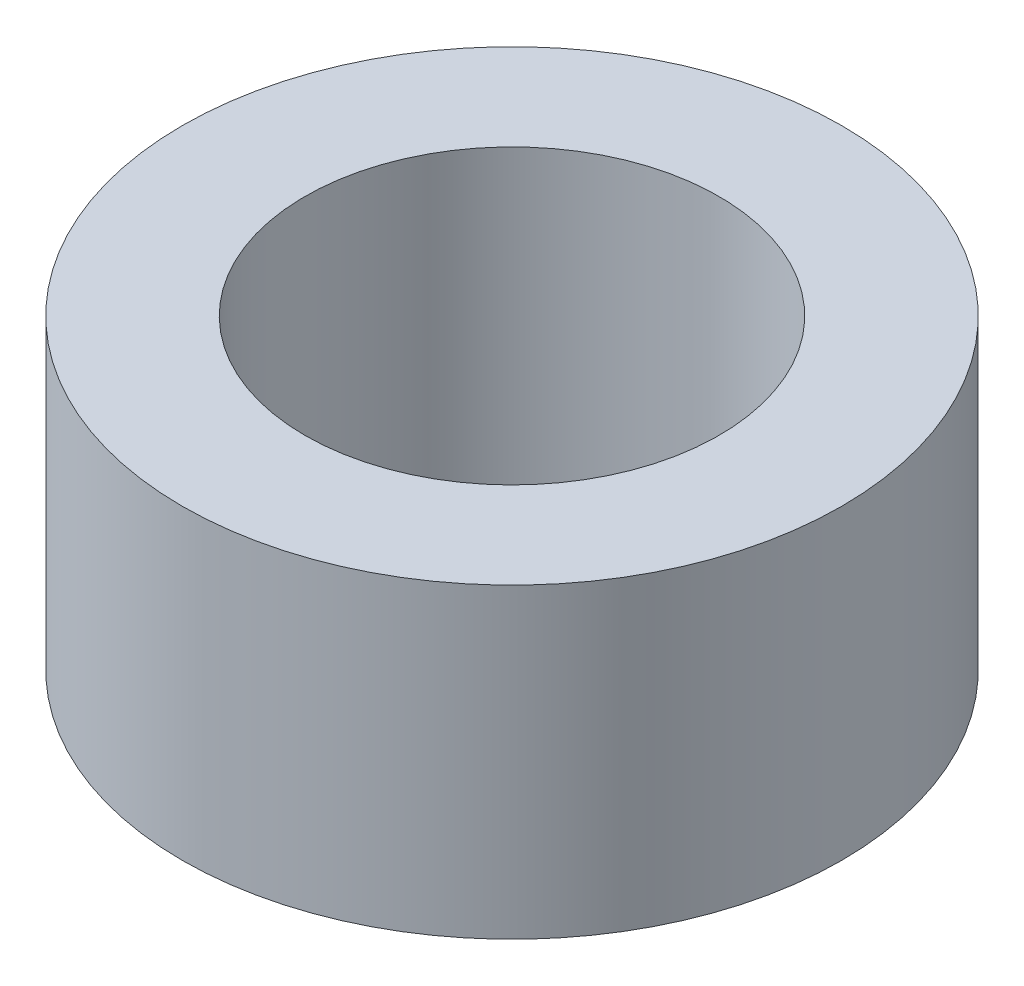
ISO-10303-21;
HEADER;
FILE_DESCRIPTION(('STEP AP214'),'2;1');
FILE_NAME('part.step','',(''),(''),'','','');
FILE_SCHEMA(('AUTOMOTIVE_DESIGN { 1 0 10303 214 1 1 1 1 }'));
ENDSEC;
DATA;
#1=APPLICATION_CONTEXT('core data for automotive mechanical design processes');
#2=APPLICATION_PROTOCOL_DEFINITION('international standard','automotive_design',2000,#1);
#3=PRODUCT_CONTEXT('',#1,'mechanical');
#4=PRODUCT('Part','Part','',(#3));
#5=PRODUCT_RELATED_PRODUCT_CATEGORY('part','',(#4));
#6=PRODUCT_DEFINITION_FORMATION('','',#4);
#7=PRODUCT_DEFINITION_CONTEXT('part definition',#1,'design');
#8=PRODUCT_DEFINITION('design','',#6,#7);
#9=PRODUCT_DEFINITION_SHAPE('','',#8);
#10=(LENGTH_UNIT() NAMED_UNIT(*) SI_UNIT(.MILLI.,.METRE.));
#11=(NAMED_UNIT(*) PLANE_ANGLE_UNIT() SI_UNIT($,.RADIAN.));
#12=(NAMED_UNIT(*) SI_UNIT($,.STERADIAN.) SOLID_ANGLE_UNIT());
#13=UNCERTAINTY_MEASURE_WITH_UNIT(LENGTH_MEASURE(1.E-05),#10,'distance_accuracy_value','');
#14=(GEOMETRIC_REPRESENTATION_CONTEXT(3) GLOBAL_UNCERTAINTY_ASSIGNED_CONTEXT((#13)) GLOBAL_UNIT_ASSIGNED_CONTEXT((#10,
#11,#12)) REPRESENTATION_CONTEXT('',''));
#15=CARTESIAN_POINT('',(0.,0.,0.));
#16=DIRECTION('',(0.,0.,1.));
#17=DIRECTION('',(1.,0.,0.));
#18=AXIS2_PLACEMENT_3D('',#15,#16,#17);
#19=CARTESIAN_POINT('',(0.,5.,0.));
#20=DIRECTION('',(0.,1.,0.));
#21=DIRECTION('',(0.,0.,1.));
#22=AXIS2_PLACEMENT_3D('',#19,#20,#21);
#23=PLANE('',#22);
#24=CARTESIAN_POINT('',(0.,5.,0.));
#25=DIRECTION('',(0.,1.,0.));
#26=DIRECTION('',(0.,0.,1.));
#27=AXIS2_PLACEMENT_3D('',#24,#25,#26);
#28=CIRCLE('',#27,5.375);
#29=CARTESIAN_POINT('',(0.,5.,5.375));
#30=VERTEX_POINT('',#29);
#31=EDGE_CURVE('E10',#30,#30,#28,.T.);
#32=ORIENTED_EDGE('',*,*,#31,.T.);
#33=EDGE_LOOP('',(#32));
#34=FACE_BOUND('',#33,.T.);
#35=CARTESIAN_POINT('',(0.,5.,0.));
#36=DIRECTION('',(0.,1.,0.));
#37=DIRECTION('',(0.,0.,1.));
#38=AXIS2_PLACEMENT_3D('',#35,#36,#37);
#39=CIRCLE('',#38,3.375);
#40=CARTESIAN_POINT('',(0.,5.,3.375));
#41=VERTEX_POINT('',#40);
#42=EDGE_CURVE('E42',#41,#41,#39,.T.);
#43=ORIENTED_EDGE('',*,*,#42,.F.);
#44=EDGE_LOOP('',(#43));
#45=FACE_BOUND('',#44,.T.);
#46=ADVANCED_FACE('F31',(#34,#45),#23,.T.);
#47=CARTESIAN_POINT('',(0.,0.,0.));
#48=DIRECTION('',(0.,1.,0.));
#49=DIRECTION('',(0.,0.,1.));
#50=AXIS2_PLACEMENT_3D('',#47,#48,#49);
#51=PLANE('',#50);
#52=CARTESIAN_POINT('',(0.,0.,0.));
#53=DIRECTION('',(0.,1.,0.));
#54=DIRECTION('',(0.,0.,1.));
#55=AXIS2_PLACEMENT_3D('',#52,#53,#54);
#56=CIRCLE('',#55,5.375);
#57=CARTESIAN_POINT('',(0.,0.,5.375));
#58=VERTEX_POINT('',#57);
#59=EDGE_CURVE('E35',#58,#58,#56,.T.);
#60=ORIENTED_EDGE('',*,*,#59,.F.);
#61=EDGE_LOOP('',(#60));
#62=FACE_BOUND('',#61,.T.);
#63=CARTESIAN_POINT('',(0.,0.,0.));
#64=DIRECTION('',(0.,1.,0.));
#65=DIRECTION('',(0.,0.,1.));
#66=AXIS2_PLACEMENT_3D('',#63,#64,#65);
#67=CIRCLE('',#66,3.375);
#68=CARTESIAN_POINT('',(0.,0.,3.375));
#69=VERTEX_POINT('',#68);
#70=EDGE_CURVE('E44',#69,#69,#67,.T.);
#71=ORIENTED_EDGE('',*,*,#70,.T.);
#72=EDGE_LOOP('',(#71));
#73=FACE_BOUND('',#72,.T.);
#74=ADVANCED_FACE('F54',(#62,#73),#51,.F.);
#75=CARTESIAN_POINT('',(0.,5.,0.));
#76=DIRECTION('',(0.,-1.,0.));
#77=DIRECTION('',(0.,0.,-1.));
#78=AXIS2_PLACEMENT_3D('',#75,#76,#77);
#79=CYLINDRICAL_SURFACE('',#78,5.375);
#80=ORIENTED_EDGE('',*,*,#31,.F.);
#81=EDGE_LOOP('',(#80));
#82=FACE_BOUND('',#81,.T.);
#83=ORIENTED_EDGE('',*,*,#59,.T.);
#84=EDGE_LOOP('',(#83));
#85=FACE_BOUND('',#84,.T.);
#86=ADVANCED_FACE('F33',(#82,#85),#79,.T.);
#87=CARTESIAN_POINT('',(0.,5.,0.));
#88=DIRECTION('',(0.,-1.,0.));
#89=DIRECTION('',(0.,0.,-1.));
#90=AXIS2_PLACEMENT_3D('',#87,#88,#89);
#91=CYLINDRICAL_SURFACE('',#90,3.375);
#92=ORIENTED_EDGE('',*,*,#42,.T.);
#93=EDGE_LOOP('',(#92));
#94=FACE_BOUND('',#93,.T.);
#95=ORIENTED_EDGE('',*,*,#70,.F.);
#96=EDGE_LOOP('',(#95));
#97=FACE_BOUND('',#96,.T.);
#98=ADVANCED_FACE('F50',(#94,#97),#91,.F.);
#99=CLOSED_SHELL('',(#46,#74,#86,#98));
#100=MANIFOLD_SOLID_BREP('B2',#99);
#101=ADVANCED_BREP_SHAPE_REPRESENTATION('',(#18,#100),#14);
#102=SHAPE_DEFINITION_REPRESENTATION(#9,#101);
ENDSEC;
END-ISO-10303-21;
